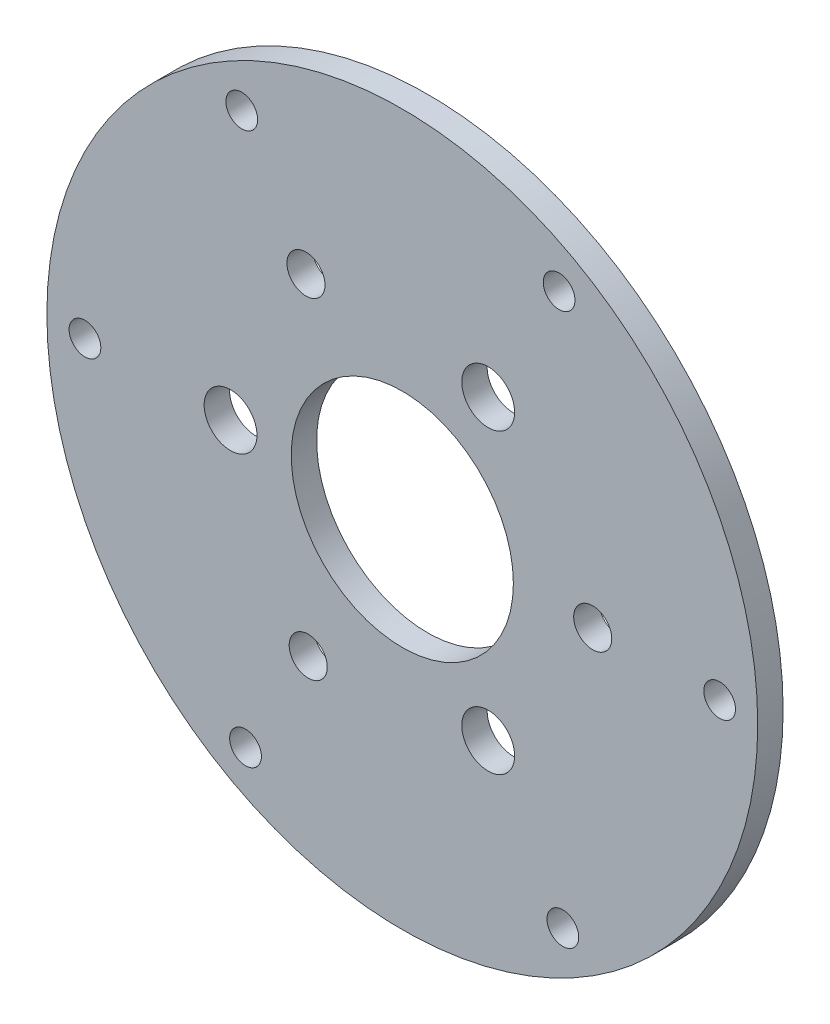
ISO-10303-21;
HEADER;
FILE_DESCRIPTION(('STEP AP214'),'2;1');
FILE_NAME('part.step','',(''),(''),'','','');
FILE_SCHEMA(('AUTOMOTIVE_DESIGN { 1 0 10303 214 1 1 1 1 }'));
ENDSEC;
DATA;
#1=APPLICATION_CONTEXT('core data for automotive mechanical design processes');
#2=APPLICATION_PROTOCOL_DEFINITION('international standard','automotive_design',2000,#1);
#3=PRODUCT_CONTEXT('',#1,'mechanical');
#4=PRODUCT('Part','Part','',(#3));
#5=PRODUCT_RELATED_PRODUCT_CATEGORY('part','',(#4));
#6=PRODUCT_DEFINITION_FORMATION('','',#4);
#7=PRODUCT_DEFINITION_CONTEXT('part definition',#1,'design');
#8=PRODUCT_DEFINITION('design','',#6,#7);
#9=PRODUCT_DEFINITION_SHAPE('','',#8);
#10=(LENGTH_UNIT() NAMED_UNIT(*) SI_UNIT(.MILLI.,.METRE.));
#11=(NAMED_UNIT(*) PLANE_ANGLE_UNIT() SI_UNIT($,.RADIAN.));
#12=(NAMED_UNIT(*) SI_UNIT($,.STERADIAN.) SOLID_ANGLE_UNIT());
#13=UNCERTAINTY_MEASURE_WITH_UNIT(LENGTH_MEASURE(1.E-05),#10,'distance_accuracy_value','');
#14=(GEOMETRIC_REPRESENTATION_CONTEXT(3) GLOBAL_UNCERTAINTY_ASSIGNED_CONTEXT((#13)) GLOBAL_UNIT_ASSIGNED_CONTEXT((#10,
#11,#12)) REPRESENTATION_CONTEXT('',''));
#15=CARTESIAN_POINT('',(0.,0.,0.));
#16=DIRECTION('',(0.,0.,1.));
#17=DIRECTION('',(1.,0.,0.));
#18=AXIS2_PLACEMENT_3D('',#15,#16,#17);
#19=CARTESIAN_POINT('',(0.,0.,2.));
#20=DIRECTION('',(0.,0.,1.));
#21=DIRECTION('',(1.,0.,0.));
#22=AXIS2_PLACEMENT_3D('',#19,#20,#21);
#23=PLANE('',#22);
#24=CARTESIAN_POINT('',(-24.9994171002763,-0.170718031686341,2.));
#25=DIRECTION('',(0.,0.,1.));
#26=DIRECTION('',(1.,0.,0.));
#27=AXIS2_PLACEMENT_3D('',#24,#25,#26);
#28=CIRCLE('',#27,1.25);
#29=CARTESIAN_POINT('',(-23.7494171002763,-0.170718031686341,2.));
#30=VERTEX_POINT('',#29);
#31=EDGE_CURVE('E106',#30,#30,#28,.T.);
#32=ORIENTED_EDGE('',*,*,#31,.F.);
#33=EDGE_LOOP('',(#32));
#34=FACE_BOUND('',#33,.T.);
#35=CARTESIAN_POINT('',(12.647554702464,-21.5647712728017,2.));
#36=DIRECTION('',(0.,0.,1.));
#37=DIRECTION('',(1.,0.,0.));
#38=AXIS2_PLACEMENT_3D('',#35,#36,#37);
#39=CIRCLE('',#38,1.25);
#40=CARTESIAN_POINT('',(13.897554702464,-21.5647712728017,2.));
#41=VERTEX_POINT('',#40);
#42=EDGE_CURVE('E94',#41,#41,#39,.T.);
#43=ORIENTED_EDGE('',*,*,#42,.F.);
#44=EDGE_LOOP('',(#43));
#45=FACE_BOUND('',#44,.T.);
#46=CARTESIAN_POINT('',(12.3518623978165,21.7354893044856,2.));
#47=DIRECTION('',(0.,0.,1.));
#48=DIRECTION('',(1.,0.,0.));
#49=AXIS2_PLACEMENT_3D('',#46,#47,#48);
#50=CIRCLE('',#49,1.25);
#51=CARTESIAN_POINT('',(13.6018623978165,21.7354893044856,2.));
#52=VERTEX_POINT('',#51);
#53=EDGE_CURVE('E82',#52,#52,#50,.T.);
#54=ORIENTED_EDGE('',*,*,#53,.F.);
#55=EDGE_LOOP('',(#54));
#56=FACE_BOUND('',#55,.T.);
#57=CARTESIAN_POINT('',(6.76500000000006,11.7173237132034,2.));
#58=DIRECTION('',(0.,0.,1.));
#59=DIRECTION('',(1.,0.,0.));
#60=AXIS2_PLACEMENT_3D('',#57,#58,#59);
#61=CIRCLE('',#60,2.08);
#62=CARTESIAN_POINT('',(8.84500000000006,11.7173237132034,2.));
#63=VERTEX_POINT('',#62);
#64=EDGE_CURVE('E70',#63,#63,#61,.T.);
#65=ORIENTED_EDGE('',*,*,#64,.F.);
#66=EDGE_LOOP('',(#65));
#67=FACE_BOUND('',#66,.T.);
#68=CARTESIAN_POINT('',(14.9996502601666,0.102430819012139,2.));
#69=DIRECTION('',(0.,0.,1.));
#70=DIRECTION('',(1.,0.,0.));
#71=AXIS2_PLACEMENT_3D('',#68,#69,#70);
#72=CIRCLE('',#71,1.5);
#73=CARTESIAN_POINT('',(16.4996502601666,0.102430819012139,2.));
#74=VERTEX_POINT('',#73);
#75=EDGE_CURVE('E58',#74,#74,#72,.T.);
#76=ORIENTED_EDGE('',*,*,#75,.F.);
#77=EDGE_LOOP('',(#76));
#78=FACE_BOUND('',#77,.T.);
#79=CARTESIAN_POINT('',(-13.53,0.,2.));
#80=DIRECTION('',(0.,0.,1.));
#81=DIRECTION('',(1.,0.,0.));
#82=AXIS2_PLACEMENT_3D('',#79,#80,#81);
#83=CIRCLE('',#82,2.08);
#84=CARTESIAN_POINT('',(-11.45,0.,2.));
#85=VERTEX_POINT('',#84);
#86=EDGE_CURVE('E46',#85,#85,#83,.T.);
#87=ORIENTED_EDGE('',*,*,#86,.F.);
#88=EDGE_LOOP('',(#87));
#89=FACE_BOUND('',#88,.T.);
#90=CARTESIAN_POINT('',(0.,0.,2.));
#91=DIRECTION('',(0.,0.,1.));
#92=DIRECTION('',(1.,0.,0.));
#93=AXIS2_PLACEMENT_3D('',#90,#91,#92);
#94=CIRCLE('',#93,28.);
#95=CARTESIAN_POINT('',(28.,0.,2.));
#96=VERTEX_POINT('',#95);
#97=EDGE_CURVE('E10',#96,#96,#94,.T.);
#98=ORIENTED_EDGE('',*,*,#97,.T.);
#99=EDGE_LOOP('',(#98));
#100=FACE_BOUND('',#99,.T.);
#101=CARTESIAN_POINT('',(-7.41111743868823,-13.0412935826923,2.));
#102=DIRECTION('',(0.,0.,1.));
#103=DIRECTION('',(1.,0.,0.));
#104=AXIS2_PLACEMENT_3D('',#101,#102,#103);
#105=CIRCLE('',#104,1.5);
#106=CARTESIAN_POINT('',(-5.91111743868823,-13.0412935826923,2.));
#107=VERTEX_POINT('',#106);
#108=EDGE_CURVE('E41',#107,#107,#105,.T.);
#109=ORIENTED_EDGE('',*,*,#108,.F.);
#110=EDGE_LOOP('',(#109));
#111=FACE_BOUND('',#110,.T.);
#112=CARTESIAN_POINT('',(-7.58853282147833,12.9388627636801,2.));
#113=DIRECTION('',(0.,0.,1.));
#114=DIRECTION('',(1.,0.,0.));
#115=AXIS2_PLACEMENT_3D('',#112,#113,#114);
#116=CIRCLE('',#115,1.5);
#117=CARTESIAN_POINT('',(-6.08853282147833,12.9388627636801,2.));
#118=VERTEX_POINT('',#117);
#119=EDGE_CURVE('E52',#118,#118,#116,.T.);
#120=ORIENTED_EDGE('',*,*,#119,.F.);
#121=EDGE_LOOP('',(#120));
#122=FACE_BOUND('',#121,.T.);
#123=CARTESIAN_POINT('',(0.,0.,2.));
#124=DIRECTION('',(0.,0.,1.));
#125=DIRECTION('',(1.,0.,0.));
#126=AXIS2_PLACEMENT_3D('',#123,#124,#125);
#127=CIRCLE('',#126,8.75);
#128=CARTESIAN_POINT('',(8.75,0.,2.));
#129=VERTEX_POINT('',#128);
#130=EDGE_CURVE('E64',#129,#129,#127,.T.);
#131=ORIENTED_EDGE('',*,*,#130,.F.);
#132=EDGE_LOOP('',(#131));
#133=FACE_BOUND('',#132,.T.);
#134=CARTESIAN_POINT('',(6.76499999999989,-11.7173237132035,2.));
#135=DIRECTION('',(0.,0.,1.));
#136=DIRECTION('',(1.,0.,0.));
#137=AXIS2_PLACEMENT_3D('',#134,#135,#136);
#138=CIRCLE('',#137,2.08);
#139=CARTESIAN_POINT('',(8.84499999999989,-11.7173237132035,2.));
#140=VERTEX_POINT('',#139);
#141=EDGE_CURVE('E76',#140,#140,#138,.T.);
#142=ORIENTED_EDGE('',*,*,#141,.F.);
#143=EDGE_LOOP('',(#142));
#144=FACE_BOUND('',#143,.T.);
#145=CARTESIAN_POINT('',(24.9994171002791,0.170718031684702,2.));
#146=DIRECTION('',(0.,0.,1.));
#147=DIRECTION('',(1.,0.,0.));
#148=AXIS2_PLACEMENT_3D('',#145,#146,#147);
#149=CIRCLE('',#148,1.25);
#150=CARTESIAN_POINT('',(26.2494171002791,0.170718031684702,2.));
#151=VERTEX_POINT('',#150);
#152=EDGE_CURVE('E88',#151,#151,#149,.T.);
#153=ORIENTED_EDGE('',*,*,#152,.F.);
#154=EDGE_LOOP('',(#153));
#155=FACE_BOUND('',#154,.T.);
#156=CARTESIAN_POINT('',(-12.3518623978137,-21.7354893044872,2.));
#157=DIRECTION('',(0.,0.,1.));
#158=DIRECTION('',(1.,0.,0.));
#159=AXIS2_PLACEMENT_3D('',#156,#157,#158);
#160=CIRCLE('',#159,1.25);
#161=CARTESIAN_POINT('',(-11.1018623978137,-21.7354893044872,2.));
#162=VERTEX_POINT('',#161);
#163=EDGE_CURVE('E100',#162,#162,#160,.T.);
#164=ORIENTED_EDGE('',*,*,#163,.F.);
#165=EDGE_LOOP('',(#164));
#166=FACE_BOUND('',#165,.T.);
#167=CARTESIAN_POINT('',(-12.6475547024612,21.5647712728,2.));
#168=DIRECTION('',(0.,0.,1.));
#169=DIRECTION('',(1.,0.,0.));
#170=AXIS2_PLACEMENT_3D('',#167,#168,#169);
#171=CIRCLE('',#170,1.25);
#172=CARTESIAN_POINT('',(-11.3975547024612,21.5647712728,2.));
#173=VERTEX_POINT('',#172);
#174=EDGE_CURVE('E112',#173,#173,#171,.T.);
#175=ORIENTED_EDGE('',*,*,#174,.F.);
#176=EDGE_LOOP('',(#175));
#177=FACE_BOUND('',#176,.T.);
#178=ADVANCED_FACE('F30',(#34,#45,#56,#67,#78,#89,#100,#111,#122,#133,#144,#155,#166,#177),#23,.T.);
#179=CARTESIAN_POINT('',(0.,0.,0.));
#180=DIRECTION('',(0.,0.,1.));
#181=DIRECTION('',(1.,0.,0.));
#182=AXIS2_PLACEMENT_3D('',#179,#180,#181);
#183=PLANE('',#182);
#184=CARTESIAN_POINT('',(0.,0.,0.));
#185=DIRECTION('',(0.,0.,1.));
#186=DIRECTION('',(1.,0.,0.));
#187=AXIS2_PLACEMENT_3D('',#184,#185,#186);
#188=CIRCLE('',#187,28.);
#189=CARTESIAN_POINT('',(28.,0.,0.));
#190=VERTEX_POINT('',#189);
#191=EDGE_CURVE('E34',#190,#190,#188,.T.);
#192=ORIENTED_EDGE('',*,*,#191,.F.);
#193=EDGE_LOOP('',(#192));
#194=FACE_BOUND('',#193,.T.);
#195=CARTESIAN_POINT('',(-7.41111743868823,-13.0412935826923,0.));
#196=DIRECTION('',(0.,0.,1.));
#197=DIRECTION('',(1.,0.,0.));
#198=AXIS2_PLACEMENT_3D('',#195,#196,#197);
#199=CIRCLE('',#198,1.5);
#200=CARTESIAN_POINT('',(-5.91111743868823,-13.0412935826923,0.));
#201=VERTEX_POINT('',#200);
#202=EDGE_CURVE('E43',#201,#201,#199,.T.);
#203=ORIENTED_EDGE('',*,*,#202,.T.);
#204=EDGE_LOOP('',(#203));
#205=FACE_BOUND('',#204,.T.);
#206=CARTESIAN_POINT('',(-13.53,0.,0.));
#207=DIRECTION('',(0.,0.,1.));
#208=DIRECTION('',(1.,0.,0.));
#209=AXIS2_PLACEMENT_3D('',#206,#207,#208);
#210=CIRCLE('',#209,2.08);
#211=CARTESIAN_POINT('',(-11.45,0.,0.));
#212=VERTEX_POINT('',#211);
#213=EDGE_CURVE('E49',#212,#212,#210,.T.);
#214=ORIENTED_EDGE('',*,*,#213,.T.);
#215=EDGE_LOOP('',(#214));
#216=FACE_BOUND('',#215,.T.);
#217=CARTESIAN_POINT('',(-7.58853282147833,12.9388627636801,0.));
#218=DIRECTION('',(0.,0.,1.));
#219=DIRECTION('',(1.,0.,0.));
#220=AXIS2_PLACEMENT_3D('',#217,#218,#219);
#221=CIRCLE('',#220,1.5);
#222=CARTESIAN_POINT('',(-6.08853282147833,12.9388627636801,0.));
#223=VERTEX_POINT('',#222);
#224=EDGE_CURVE('E55',#223,#223,#221,.T.);
#225=ORIENTED_EDGE('',*,*,#224,.T.);
#226=EDGE_LOOP('',(#225));
#227=FACE_BOUND('',#226,.T.);
#228=CARTESIAN_POINT('',(14.9996502601666,0.102430819012139,0.));
#229=DIRECTION('',(0.,0.,1.));
#230=DIRECTION('',(1.,0.,0.));
#231=AXIS2_PLACEMENT_3D('',#228,#229,#230);
#232=CIRCLE('',#231,1.5);
#233=CARTESIAN_POINT('',(16.4996502601666,0.102430819012139,0.));
#234=VERTEX_POINT('',#233);
#235=EDGE_CURVE('E61',#234,#234,#232,.T.);
#236=ORIENTED_EDGE('',*,*,#235,.T.);
#237=EDGE_LOOP('',(#236));
#238=FACE_BOUND('',#237,.T.);
#239=CARTESIAN_POINT('',(0.,0.,0.));
#240=DIRECTION('',(0.,0.,1.));
#241=DIRECTION('',(1.,0.,0.));
#242=AXIS2_PLACEMENT_3D('',#239,#240,#241);
#243=CIRCLE('',#242,8.75);
#244=CARTESIAN_POINT('',(8.75,0.,0.));
#245=VERTEX_POINT('',#244);
#246=EDGE_CURVE('E67',#245,#245,#243,.T.);
#247=ORIENTED_EDGE('',*,*,#246,.T.);
#248=EDGE_LOOP('',(#247));
#249=FACE_BOUND('',#248,.T.);
#250=CARTESIAN_POINT('',(6.76500000000006,11.7173237132034,0.));
#251=DIRECTION('',(0.,0.,1.));
#252=DIRECTION('',(1.,0.,0.));
#253=AXIS2_PLACEMENT_3D('',#250,#251,#252);
#254=CIRCLE('',#253,2.08);
#255=CARTESIAN_POINT('',(8.84500000000006,11.7173237132034,0.));
#256=VERTEX_POINT('',#255);
#257=EDGE_CURVE('E73',#256,#256,#254,.T.);
#258=ORIENTED_EDGE('',*,*,#257,.T.);
#259=EDGE_LOOP('',(#258));
#260=FACE_BOUND('',#259,.T.);
#261=CARTESIAN_POINT('',(6.76499999999989,-11.7173237132035,0.));
#262=DIRECTION('',(0.,0.,1.));
#263=DIRECTION('',(1.,0.,0.));
#264=AXIS2_PLACEMENT_3D('',#261,#262,#263);
#265=CIRCLE('',#264,2.08);
#266=CARTESIAN_POINT('',(8.84499999999989,-11.7173237132035,0.));
#267=VERTEX_POINT('',#266);
#268=EDGE_CURVE('E79',#267,#267,#265,.T.);
#269=ORIENTED_EDGE('',*,*,#268,.T.);
#270=EDGE_LOOP('',(#269));
#271=FACE_BOUND('',#270,.T.);
#272=CARTESIAN_POINT('',(12.3518623978165,21.7354893044856,0.));
#273=DIRECTION('',(0.,0.,1.));
#274=DIRECTION('',(1.,0.,0.));
#275=AXIS2_PLACEMENT_3D('',#272,#273,#274);
#276=CIRCLE('',#275,1.25);
#277=CARTESIAN_POINT('',(13.6018623978165,21.7354893044856,0.));
#278=VERTEX_POINT('',#277);
#279=EDGE_CURVE('E85',#278,#278,#276,.T.);
#280=ORIENTED_EDGE('',*,*,#279,.T.);
#281=EDGE_LOOP('',(#280));
#282=FACE_BOUND('',#281,.T.);
#283=CARTESIAN_POINT('',(24.9994171002791,0.170718031684702,0.));
#284=DIRECTION('',(0.,0.,1.));
#285=DIRECTION('',(1.,0.,0.));
#286=AXIS2_PLACEMENT_3D('',#283,#284,#285);
#287=CIRCLE('',#286,1.25);
#288=CARTESIAN_POINT('',(26.2494171002791,0.170718031684702,0.));
#289=VERTEX_POINT('',#288);
#290=EDGE_CURVE('E91',#289,#289,#287,.T.);
#291=ORIENTED_EDGE('',*,*,#290,.T.);
#292=EDGE_LOOP('',(#291));
#293=FACE_BOUND('',#292,.T.);
#294=CARTESIAN_POINT('',(12.647554702464,-21.5647712728017,0.));
#295=DIRECTION('',(0.,0.,1.));
#296=DIRECTION('',(1.,0.,0.));
#297=AXIS2_PLACEMENT_3D('',#294,#295,#296);
#298=CIRCLE('',#297,1.25);
#299=CARTESIAN_POINT('',(13.897554702464,-21.5647712728017,0.));
#300=VERTEX_POINT('',#299);
#301=EDGE_CURVE('E97',#300,#300,#298,.T.);
#302=ORIENTED_EDGE('',*,*,#301,.T.);
#303=EDGE_LOOP('',(#302));
#304=FACE_BOUND('',#303,.T.);
#305=CARTESIAN_POINT('',(-12.3518623978137,-21.7354893044872,0.));
#306=DIRECTION('',(0.,0.,1.));
#307=DIRECTION('',(1.,0.,0.));
#308=AXIS2_PLACEMENT_3D('',#305,#306,#307);
#309=CIRCLE('',#308,1.25);
#310=CARTESIAN_POINT('',(-11.1018623978137,-21.7354893044872,0.));
#311=VERTEX_POINT('',#310);
#312=EDGE_CURVE('E103',#311,#311,#309,.T.);
#313=ORIENTED_EDGE('',*,*,#312,.T.);
#314=EDGE_LOOP('',(#313));
#315=FACE_BOUND('',#314,.T.);
#316=CARTESIAN_POINT('',(-24.9994171002763,-0.170718031686341,0.));
#317=DIRECTION('',(0.,0.,1.));
#318=DIRECTION('',(1.,0.,0.));
#319=AXIS2_PLACEMENT_3D('',#316,#317,#318);
#320=CIRCLE('',#319,1.25);
#321=CARTESIAN_POINT('',(-23.7494171002763,-0.170718031686341,0.));
#322=VERTEX_POINT('',#321);
#323=EDGE_CURVE('E109',#322,#322,#320,.T.);
#324=ORIENTED_EDGE('',*,*,#323,.T.);
#325=EDGE_LOOP('',(#324));
#326=FACE_BOUND('',#325,.T.);
#327=CARTESIAN_POINT('',(-12.6475547024612,21.5647712728,0.));
#328=DIRECTION('',(0.,0.,1.));
#329=DIRECTION('',(1.,0.,0.));
#330=AXIS2_PLACEMENT_3D('',#327,#328,#329);
#331=CIRCLE('',#330,1.25);
#332=CARTESIAN_POINT('',(-11.3975547024612,21.5647712728,0.));
#333=VERTEX_POINT('',#332);
#334=EDGE_CURVE('E115',#333,#333,#331,.T.);
#335=ORIENTED_EDGE('',*,*,#334,.T.);
#336=EDGE_LOOP('',(#335));
#337=FACE_BOUND('',#336,.T.);
#338=ADVANCED_FACE('F125',(#194,#205,#216,#227,#238,#249,#260,#271,#282,#293,#304,#315,#326,
#337),#183,.F.);
#339=CARTESIAN_POINT('',(0.,0.,2.));
#340=DIRECTION('',(0.,0.,-1.));
#341=DIRECTION('',(-1.,0.,0.));
#342=AXIS2_PLACEMENT_3D('',#339,#340,#341);
#343=CYLINDRICAL_SURFACE('',#342,28.);
#344=ORIENTED_EDGE('',*,*,#97,.F.);
#345=EDGE_LOOP('',(#344));
#346=FACE_BOUND('',#345,.T.);
#347=ORIENTED_EDGE('',*,*,#191,.T.);
#348=EDGE_LOOP('',(#347));
#349=FACE_BOUND('',#348,.T.);
#350=ADVANCED_FACE('F32',(#346,#349),#343,.T.);
#351=CARTESIAN_POINT('',(-7.41111743868823,-13.0412935826923,2.));
#352=DIRECTION('',(0.,0.,-1.));
#353=DIRECTION('',(-1.,0.,0.));
#354=AXIS2_PLACEMENT_3D('',#351,#352,#353);
#355=CYLINDRICAL_SURFACE('',#354,1.5);
#356=ORIENTED_EDGE('',*,*,#108,.T.);
#357=EDGE_LOOP('',(#356));
#358=FACE_BOUND('',#357,.T.);
#359=ORIENTED_EDGE('',*,*,#202,.F.);
#360=EDGE_LOOP('',(#359));
#361=FACE_BOUND('',#360,.T.);
#362=ADVANCED_FACE('F135',(#358,#361),#355,.F.);
#363=CARTESIAN_POINT('',(-13.53,0.,2.));
#364=DIRECTION('',(0.,0.,-1.));
#365=DIRECTION('',(-1.,0.,0.));
#366=AXIS2_PLACEMENT_3D('',#363,#364,#365);
#367=CYLINDRICAL_SURFACE('',#366,2.08);
#368=ORIENTED_EDGE('',*,*,#86,.T.);
#369=EDGE_LOOP('',(#368));
#370=FACE_BOUND('',#369,.T.);
#371=ORIENTED_EDGE('',*,*,#213,.F.);
#372=EDGE_LOOP('',(#371));
#373=FACE_BOUND('',#372,.T.);
#374=ADVANCED_FACE('F138',(#370,#373),#367,.F.);
#375=CARTESIAN_POINT('',(-7.58853282147833,12.9388627636801,2.));
#376=DIRECTION('',(0.,0.,-1.));
#377=DIRECTION('',(-1.,0.,0.));
#378=AXIS2_PLACEMENT_3D('',#375,#376,#377);
#379=CYLINDRICAL_SURFACE('',#378,1.5);
#380=ORIENTED_EDGE('',*,*,#119,.T.);
#381=EDGE_LOOP('',(#380));
#382=FACE_BOUND('',#381,.T.);
#383=ORIENTED_EDGE('',*,*,#224,.F.);
#384=EDGE_LOOP('',(#383));
#385=FACE_BOUND('',#384,.T.);
#386=ADVANCED_FACE('F142',(#382,#385),#379,.F.);
#387=CARTESIAN_POINT('',(14.9996502601666,0.102430819012139,2.));
#388=DIRECTION('',(0.,0.,-1.));
#389=DIRECTION('',(-1.,0.,0.));
#390=AXIS2_PLACEMENT_3D('',#387,#388,#389);
#391=CYLINDRICAL_SURFACE('',#390,1.5);
#392=ORIENTED_EDGE('',*,*,#75,.T.);
#393=EDGE_LOOP('',(#392));
#394=FACE_BOUND('',#393,.T.);
#395=ORIENTED_EDGE('',*,*,#235,.F.);
#396=EDGE_LOOP('',(#395));
#397=FACE_BOUND('',#396,.T.);
#398=ADVANCED_FACE('F146',(#394,#397),#391,.F.);
#399=CARTESIAN_POINT('',(0.,0.,2.));
#400=DIRECTION('',(0.,0.,-1.));
#401=DIRECTION('',(-1.,0.,0.));
#402=AXIS2_PLACEMENT_3D('',#399,#400,#401);
#403=CYLINDRICAL_SURFACE('',#402,8.75);
#404=ORIENTED_EDGE('',*,*,#130,.T.);
#405=EDGE_LOOP('',(#404));
#406=FACE_BOUND('',#405,.T.);
#407=ORIENTED_EDGE('',*,*,#246,.F.);
#408=EDGE_LOOP('',(#407));
#409=FACE_BOUND('',#408,.T.);
#410=ADVANCED_FACE('F150',(#406,#409),#403,.F.);
#411=CARTESIAN_POINT('',(6.76500000000006,11.7173237132034,2.));
#412=DIRECTION('',(0.,0.,-1.));
#413=DIRECTION('',(-1.,0.,0.));
#414=AXIS2_PLACEMENT_3D('',#411,#412,#413);
#415=CYLINDRICAL_SURFACE('',#414,2.08);
#416=ORIENTED_EDGE('',*,*,#64,.T.);
#417=EDGE_LOOP('',(#416));
#418=FACE_BOUND('',#417,.T.);
#419=ORIENTED_EDGE('',*,*,#257,.F.);
#420=EDGE_LOOP('',(#419));
#421=FACE_BOUND('',#420,.T.);
#422=ADVANCED_FACE('F154',(#418,#421),#415,.F.);
#423=CARTESIAN_POINT('',(6.76499999999989,-11.7173237132035,2.));
#424=DIRECTION('',(0.,0.,-1.));
#425=DIRECTION('',(-1.,0.,0.));
#426=AXIS2_PLACEMENT_3D('',#423,#424,#425);
#427=CYLINDRICAL_SURFACE('',#426,2.08);
#428=ORIENTED_EDGE('',*,*,#141,.T.);
#429=EDGE_LOOP('',(#428));
#430=FACE_BOUND('',#429,.T.);
#431=ORIENTED_EDGE('',*,*,#268,.F.);
#432=EDGE_LOOP('',(#431));
#433=FACE_BOUND('',#432,.T.);
#434=ADVANCED_FACE('F158',(#430,#433),#427,.F.);
#435=CARTESIAN_POINT('',(12.3518623978165,21.7354893044856,2.));
#436=DIRECTION('',(0.,0.,-1.));
#437=DIRECTION('',(-1.,0.,0.));
#438=AXIS2_PLACEMENT_3D('',#435,#436,#437);
#439=CYLINDRICAL_SURFACE('',#438,1.25);
#440=ORIENTED_EDGE('',*,*,#53,.T.);
#441=EDGE_LOOP('',(#440));
#442=FACE_BOUND('',#441,.T.);
#443=ORIENTED_EDGE('',*,*,#279,.F.);
#444=EDGE_LOOP('',(#443));
#445=FACE_BOUND('',#444,.T.);
#446=ADVANCED_FACE('F162',(#442,#445),#439,.F.);
#447=CARTESIAN_POINT('',(24.9994171002791,0.170718031684702,2.));
#448=DIRECTION('',(0.,0.,-1.));
#449=DIRECTION('',(-1.,0.,0.));
#450=AXIS2_PLACEMENT_3D('',#447,#448,#449);
#451=CYLINDRICAL_SURFACE('',#450,1.25);
#452=ORIENTED_EDGE('',*,*,#152,.T.);
#453=EDGE_LOOP('',(#452));
#454=FACE_BOUND('',#453,.T.);
#455=ORIENTED_EDGE('',*,*,#290,.F.);
#456=EDGE_LOOP('',(#455));
#457=FACE_BOUND('',#456,.T.);
#458=ADVANCED_FACE('F166',(#454,#457),#451,.F.);
#459=CARTESIAN_POINT('',(12.647554702464,-21.5647712728017,2.));
#460=DIRECTION('',(0.,0.,-1.));
#461=DIRECTION('',(-1.,0.,0.));
#462=AXIS2_PLACEMENT_3D('',#459,#460,#461);
#463=CYLINDRICAL_SURFACE('',#462,1.25);
#464=ORIENTED_EDGE('',*,*,#42,.T.);
#465=EDGE_LOOP('',(#464));
#466=FACE_BOUND('',#465,.T.);
#467=ORIENTED_EDGE('',*,*,#301,.F.);
#468=EDGE_LOOP('',(#467));
#469=FACE_BOUND('',#468,.T.);
#470=ADVANCED_FACE('F170',(#466,#469),#463,.F.);
#471=CARTESIAN_POINT('',(-12.3518623978137,-21.7354893044872,2.));
#472=DIRECTION('',(0.,0.,-1.));
#473=DIRECTION('',(-1.,0.,0.));
#474=AXIS2_PLACEMENT_3D('',#471,#472,#473);
#475=CYLINDRICAL_SURFACE('',#474,1.25);
#476=ORIENTED_EDGE('',*,*,#163,.T.);
#477=EDGE_LOOP('',(#476));
#478=FACE_BOUND('',#477,.T.);
#479=ORIENTED_EDGE('',*,*,#312,.F.);
#480=EDGE_LOOP('',(#479));
#481=FACE_BOUND('',#480,.T.);
#482=ADVANCED_FACE('F174',(#478,#481),#475,.F.);
#483=CARTESIAN_POINT('',(-24.9994171002763,-0.170718031686341,2.));
#484=DIRECTION('',(0.,0.,-1.));
#485=DIRECTION('',(-1.,0.,0.));
#486=AXIS2_PLACEMENT_3D('',#483,#484,#485);
#487=CYLINDRICAL_SURFACE('',#486,1.25);
#488=ORIENTED_EDGE('',*,*,#31,.T.);
#489=EDGE_LOOP('',(#488));
#490=FACE_BOUND('',#489,.T.);
#491=ORIENTED_EDGE('',*,*,#323,.F.);
#492=EDGE_LOOP('',(#491));
#493=FACE_BOUND('',#492,.T.);
#494=ADVANCED_FACE('F178',(#490,#493),#487,.F.);
#495=CARTESIAN_POINT('',(-12.6475547024612,21.5647712728,2.));
#496=DIRECTION('',(0.,0.,-1.));
#497=DIRECTION('',(-1.,0.,0.));
#498=AXIS2_PLACEMENT_3D('',#495,#496,#497);
#499=CYLINDRICAL_SURFACE('',#498,1.25);
#500=ORIENTED_EDGE('',*,*,#174,.T.);
#501=EDGE_LOOP('',(#500));
#502=FACE_BOUND('',#501,.T.);
#503=ORIENTED_EDGE('',*,*,#334,.F.);
#504=EDGE_LOOP('',(#503));
#505=FACE_BOUND('',#504,.T.);
#506=ADVANCED_FACE('F121',(#502,#505),#499,.F.);
#507=CLOSED_SHELL('',(#178,#338,#350,#362,#374,#386,#398,#410,#422,#434,#446,#458,#470,#482,
#494,#506));
#508=MANIFOLD_SOLID_BREP('B2',#507);
#509=ADVANCED_BREP_SHAPE_REPRESENTATION('',(#18,#508),#14);
#510=SHAPE_DEFINITION_REPRESENTATION(#9,#509);
ENDSEC;
END-ISO-10303-21;
